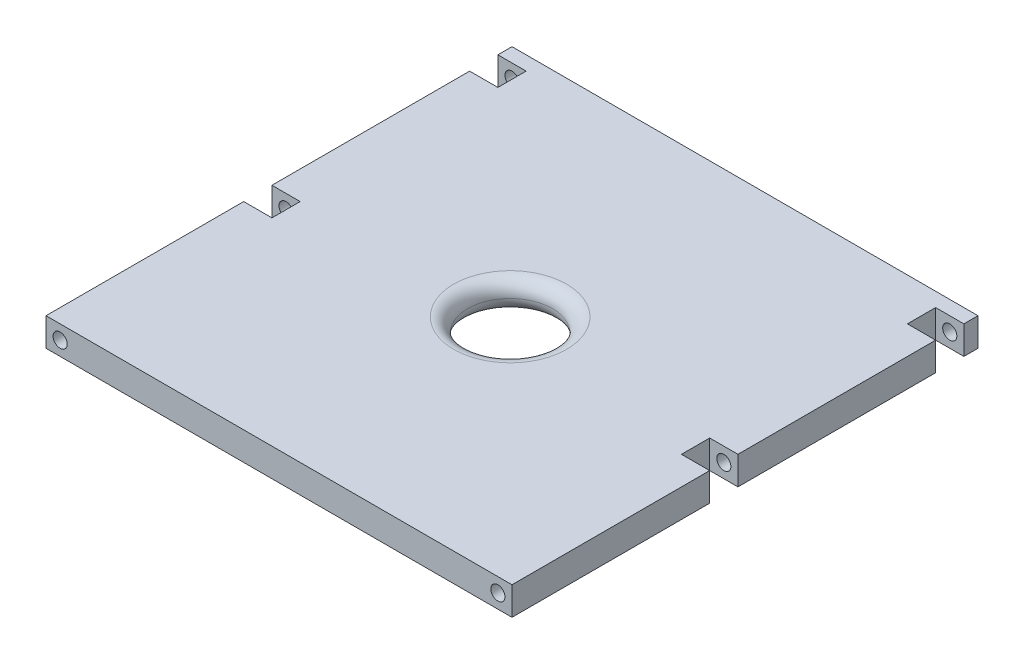
ISO-10303-21;
HEADER;
FILE_DESCRIPTION(('STEP AP214'),'2;1');
FILE_NAME('part.step','',(''),(''),'','','');
FILE_SCHEMA(('AUTOMOTIVE_DESIGN { 1 0 10303 214 1 1 1 1 }'));
ENDSEC;
DATA;
#1=APPLICATION_CONTEXT('core data for automotive mechanical design processes');
#2=APPLICATION_PROTOCOL_DEFINITION('international standard','automotive_design',2000,#1);
#3=PRODUCT_CONTEXT('',#1,'mechanical');
#4=PRODUCT('Part','Part','',(#3));
#5=PRODUCT_RELATED_PRODUCT_CATEGORY('part','',(#4));
#6=PRODUCT_DEFINITION_FORMATION('','',#4);
#7=PRODUCT_DEFINITION_CONTEXT('part definition',#1,'design');
#8=PRODUCT_DEFINITION('design','',#6,#7);
#9=PRODUCT_DEFINITION_SHAPE('','',#8);
#10=(LENGTH_UNIT() NAMED_UNIT(*) SI_UNIT(.MILLI.,.METRE.));
#11=(NAMED_UNIT(*) PLANE_ANGLE_UNIT() SI_UNIT($,.RADIAN.));
#12=(NAMED_UNIT(*) SI_UNIT($,.STERADIAN.) SOLID_ANGLE_UNIT());
#13=UNCERTAINTY_MEASURE_WITH_UNIT(LENGTH_MEASURE(1.E-05),#10,'distance_accuracy_value','');
#14=(GEOMETRIC_REPRESENTATION_CONTEXT(3) GLOBAL_UNCERTAINTY_ASSIGNED_CONTEXT((#13)) GLOBAL_UNIT_ASSIGNED_CONTEXT((#10,
#11,#12)) REPRESENTATION_CONTEXT('',''));
#15=CARTESIAN_POINT('',(0.,0.,0.));
#16=DIRECTION('',(0.,0.,1.));
#17=DIRECTION('',(1.,0.,0.));
#18=AXIS2_PLACEMENT_3D('',#15,#16,#17);
#19=CARTESIAN_POINT('',(0.,10.,0.));
#20=DIRECTION('',(0.,-1.,0.));
#21=DIRECTION('',(0.,0.,-1.));
#22=AXIS2_PLACEMENT_3D('',#19,#20,#21);
#23=PLANE('',#22);
#24=CARTESIAN_POINT('',(0.,10.,0.648107224862339));
#25=DIRECTION('',(0.,-1.,0.));
#26=DIRECTION('',(0.,0.,-1.));
#27=AXIS2_PLACEMENT_3D('',#24,#25,#26);
#28=CIRCLE('',#27,20.);
#29=CARTESIAN_POINT('',(0.,10.,-19.3518927751377));
#30=VERTEX_POINT('',#29);
#31=EDGE_CURVE('E11',#30,#30,#28,.T.);
#32=ORIENTED_EDGE('',*,*,#31,.T.);
#33=EDGE_LOOP('',(#32));
#34=FACE_BOUND('',#33,.T.);
#35=DIRECTION('',(0.,0.,1.));
#36=VECTOR('',#35,1.);
#37=CARTESIAN_POINT('',(-82.5,10.,12.5));
#38=LINE('',#37,#36);
#39=CARTESIAN_POINT('',(-82.5,10.,12.5));
#40=VERTEX_POINT('',#39);
#41=CARTESIAN_POINT('',(-82.5,10.,82.5));
#42=VERTEX_POINT('',#41);
#43=EDGE_CURVE('E241',#40,#42,#38,.T.);
#44=ORIENTED_EDGE('',*,*,#43,.T.);
#45=DIRECTION('',(1.,0.,0.));
#46=VECTOR('',#45,1.);
#47=CARTESIAN_POINT('',(82.5,10.,82.5));
#48=LINE('',#47,#46);
#49=CARTESIAN_POINT('',(82.5,10.,82.5));
#50=VERTEX_POINT('',#49);
#51=EDGE_CURVE('E130',#42,#50,#48,.T.);
#52=ORIENTED_EDGE('',*,*,#51,.T.);
#53=DIRECTION('',(0.,0.,-1.));
#54=VECTOR('',#53,1.);
#55=CARTESIAN_POINT('',(82.5,10.,12.5));
#56=LINE('',#55,#54);
#57=CARTESIAN_POINT('',(82.5,10.,12.5));
#58=VERTEX_POINT('',#57);
#59=EDGE_CURVE('E409',#50,#58,#56,.T.);
#60=ORIENTED_EDGE('',*,*,#59,.T.);
#61=DIRECTION('',(-1.,0.,0.));
#62=VECTOR('',#61,1.);
#63=CARTESIAN_POINT('',(72.5,10.,12.5));
#64=LINE('',#63,#62);
#65=CARTESIAN_POINT('',(72.5,10.,12.5));
#66=VERTEX_POINT('',#65);
#67=EDGE_CURVE('E411',#58,#66,#64,.T.);
#68=ORIENTED_EDGE('',*,*,#67,.T.);
#69=DIRECTION('',(0.,0.,-1.));
#70=VECTOR('',#69,1.);
#71=CARTESIAN_POINT('',(72.5,10.,2.49999999999997));
#72=LINE('',#71,#70);
#73=CARTESIAN_POINT('',(72.5,10.,2.49999999999997));
#74=VERTEX_POINT('',#73);
#75=EDGE_CURVE('E413',#66,#74,#72,.T.);
#76=ORIENTED_EDGE('',*,*,#75,.T.);
#77=DIRECTION('',(1.,0.,0.));
#78=VECTOR('',#77,1.);
#79=CARTESIAN_POINT('',(82.5,10.,2.49999999999999));
#80=LINE('',#79,#78);
#81=CARTESIAN_POINT('',(82.5,10.,2.49999999999999));
#82=VERTEX_POINT('',#81);
#83=EDGE_CURVE('E419',#74,#82,#80,.T.);
#84=ORIENTED_EDGE('',*,*,#83,.T.);
#85=DIRECTION('',(0.,0.,-1.));
#86=VECTOR('',#85,1.);
#87=CARTESIAN_POINT('',(82.5,10.,-67.5));
#88=LINE('',#87,#86);
#89=CARTESIAN_POINT('',(82.5,10.,-67.5));
#90=VERTEX_POINT('',#89);
#91=EDGE_CURVE('E421',#82,#90,#88,.T.);
#92=ORIENTED_EDGE('',*,*,#91,.T.);
#93=DIRECTION('',(-1.,0.,0.));
#94=VECTOR('',#93,1.);
#95=CARTESIAN_POINT('',(72.5,10.,-67.5));
#96=LINE('',#95,#94);
#97=CARTESIAN_POINT('',(72.5,10.,-67.5));
#98=VERTEX_POINT('',#97);
#99=EDGE_CURVE('E423',#90,#98,#96,.T.);
#100=ORIENTED_EDGE('',*,*,#99,.T.);
#101=DIRECTION('',(0.,0.,-1.));
#102=VECTOR('',#101,1.);
#103=CARTESIAN_POINT('',(72.5,10.,-77.5));
#104=LINE('',#103,#102);
#105=CARTESIAN_POINT('',(72.5,10.,-77.5));
#106=VERTEX_POINT('',#105);
#107=EDGE_CURVE('E425',#98,#106,#104,.T.);
#108=ORIENTED_EDGE('',*,*,#107,.T.);
#109=DIRECTION('',(1.,0.,0.));
#110=VECTOR('',#109,1.);
#111=CARTESIAN_POINT('',(82.5,10.,-77.5));
#112=LINE('',#111,#110);
#113=CARTESIAN_POINT('',(82.5,10.,-77.5));
#114=VERTEX_POINT('',#113);
#115=EDGE_CURVE('E427',#106,#114,#112,.T.);
#116=ORIENTED_EDGE('',*,*,#115,.T.);
#117=DIRECTION('',(0.,0.,-1.));
#118=VECTOR('',#117,1.);
#119=CARTESIAN_POINT('',(82.5,10.,-82.5));
#120=LINE('',#119,#118);
#121=CARTESIAN_POINT('',(82.5,10.,-82.5));
#122=VERTEX_POINT('',#121);
#123=EDGE_CURVE('E429',#114,#122,#120,.T.);
#124=ORIENTED_EDGE('',*,*,#123,.T.);
#125=DIRECTION('',(-1.,0.,0.));
#126=VECTOR('',#125,1.);
#127=CARTESIAN_POINT('',(82.5,10.,-82.5));
#128=LINE('',#127,#126);
#129=CARTESIAN_POINT('',(-82.5,10.,-82.5));
#130=VERTEX_POINT('',#129);
#131=EDGE_CURVE('E431',#122,#130,#128,.T.);
#132=ORIENTED_EDGE('',*,*,#131,.T.);
#133=DIRECTION('',(0.,0.,1.));
#134=VECTOR('',#133,1.);
#135=CARTESIAN_POINT('',(-82.5,10.,-82.5));
#136=LINE('',#135,#134);
#137=CARTESIAN_POINT('',(-82.5,10.,-77.5));
#138=VERTEX_POINT('',#137);
#139=EDGE_CURVE('E433',#130,#138,#136,.T.);
#140=ORIENTED_EDGE('',*,*,#139,.T.);
#141=DIRECTION('',(1.,0.,0.));
#142=VECTOR('',#141,1.);
#143=CARTESIAN_POINT('',(-82.5,10.,-77.5));
#144=LINE('',#143,#142);
#145=CARTESIAN_POINT('',(-72.5,10.,-77.5));
#146=VERTEX_POINT('',#145);
#147=EDGE_CURVE('E435',#138,#146,#144,.T.);
#148=ORIENTED_EDGE('',*,*,#147,.T.);
#149=DIRECTION('',(0.,0.,1.));
#150=VECTOR('',#149,1.);
#151=CARTESIAN_POINT('',(-72.5,10.,-77.5));
#152=LINE('',#151,#150);
#153=CARTESIAN_POINT('',(-72.5,10.,-67.5));
#154=VERTEX_POINT('',#153);
#155=EDGE_CURVE('E437',#146,#154,#152,.T.);
#156=ORIENTED_EDGE('',*,*,#155,.T.);
#157=DIRECTION('',(-1.,0.,0.));
#158=VECTOR('',#157,1.);
#159=CARTESIAN_POINT('',(-72.5,10.,-67.5));
#160=LINE('',#159,#158);
#161=CARTESIAN_POINT('',(-82.5,10.,-67.5));
#162=VERTEX_POINT('',#161);
#163=EDGE_CURVE('E439',#154,#162,#160,.T.);
#164=ORIENTED_EDGE('',*,*,#163,.T.);
#165=DIRECTION('',(0.,0.,1.));
#166=VECTOR('',#165,1.);
#167=CARTESIAN_POINT('',(-82.5,10.,-67.5));
#168=LINE('',#167,#166);
#169=CARTESIAN_POINT('',(-82.5,10.,2.49999999999999));
#170=VERTEX_POINT('',#169);
#171=EDGE_CURVE('E184',#162,#170,#168,.T.);
#172=ORIENTED_EDGE('',*,*,#171,.T.);
#173=DIRECTION('',(1.,0.,0.));
#174=VECTOR('',#173,1.);
#175=CARTESIAN_POINT('',(-82.5,10.,2.49999999999999));
#176=LINE('',#175,#174);
#177=CARTESIAN_POINT('',(-72.5,10.,2.49999999999997));
#178=VERTEX_POINT('',#177);
#179=EDGE_CURVE('E179',#170,#178,#176,.T.);
#180=ORIENTED_EDGE('',*,*,#179,.T.);
#181=DIRECTION('',(0.,0.,1.));
#182=VECTOR('',#181,1.);
#183=CARTESIAN_POINT('',(-72.5,10.,2.49999999999997));
#184=LINE('',#183,#182);
#185=CARTESIAN_POINT('',(-72.5,10.,12.5));
#186=VERTEX_POINT('',#185);
#187=EDGE_CURVE('E182',#178,#186,#184,.T.);
#188=ORIENTED_EDGE('',*,*,#187,.T.);
#189=DIRECTION('',(-1.,0.,0.));
#190=VECTOR('',#189,1.);
#191=CARTESIAN_POINT('',(-72.5,10.,12.5));
#192=LINE('',#191,#190);
#193=EDGE_CURVE('E50',#186,#40,#192,.T.);
#194=ORIENTED_EDGE('',*,*,#193,.T.);
#195=EDGE_LOOP('',(#44,#52,#60,#68,#76,#84,#92,#100,#108,#116,#124,#132,#140,#148,#156,#164,
#172,#180,#188,#194));
#196=FACE_BOUND('',#195,.T.);
#197=ADVANCED_FACE('F32',(#34,#196),#23,.F.);
#198=CARTESIAN_POINT('',(0.,0.,0.));
#199=DIRECTION('',(0.,-1.,0.));
#200=DIRECTION('',(0.,0.,-1.));
#201=AXIS2_PLACEMENT_3D('',#198,#199,#200);
#202=PLANE('',#201);
#203=CARTESIAN_POINT('',(0.,0.,0.648107224862339));
#204=DIRECTION('',(0.,-1.,0.));
#205=DIRECTION('',(0.,0.,-1.));
#206=AXIS2_PLACEMENT_3D('',#203,#204,#205);
#207=CIRCLE('',#206,20.);
#208=CARTESIAN_POINT('',(0.,0.,-19.3518927751377));
#209=VERTEX_POINT('',#208);
#210=EDGE_CURVE('E42',#209,#209,#207,.F.);
#211=ORIENTED_EDGE('',*,*,#210,.T.);
#212=EDGE_LOOP('',(#211));
#213=FACE_BOUND('',#212,.T.);
#214=DIRECTION('',(0.,0.,1.));
#215=VECTOR('',#214,1.);
#216=CARTESIAN_POINT('',(-82.5,0.,12.5));
#217=LINE('',#216,#215);
#218=CARTESIAN_POINT('',(-82.5,0.,12.5));
#219=VERTEX_POINT('',#218);
#220=CARTESIAN_POINT('',(-82.5,0.,82.5));
#221=VERTEX_POINT('',#220);
#222=EDGE_CURVE('E202',#219,#221,#217,.T.);
#223=ORIENTED_EDGE('',*,*,#222,.F.);
#224=DIRECTION('',(-1.,0.,0.));
#225=VECTOR('',#224,1.);
#226=CARTESIAN_POINT('',(-72.5,0.,12.5));
#227=LINE('',#226,#225);
#228=CARTESIAN_POINT('',(-72.5,0.,12.5));
#229=VERTEX_POINT('',#228);
#230=EDGE_CURVE('E121',#229,#219,#227,.T.);
#231=ORIENTED_EDGE('',*,*,#230,.F.);
#232=DIRECTION('',(0.,0.,1.));
#233=VECTOR('',#232,1.);
#234=CARTESIAN_POINT('',(-72.5,0.,2.49999999999997));
#235=LINE('',#234,#233);
#236=CARTESIAN_POINT('',(-72.5,0.,2.49999999999997));
#237=VERTEX_POINT('',#236);
#238=EDGE_CURVE('E115',#237,#229,#235,.T.);
#239=ORIENTED_EDGE('',*,*,#238,.F.);
#240=DIRECTION('',(1.,0.,0.));
#241=VECTOR('',#240,1.);
#242=CARTESIAN_POINT('',(-82.5,0.,2.49999999999999));
#243=LINE('',#242,#241);
#244=CARTESIAN_POINT('',(-82.5,0.,2.49999999999999));
#245=VERTEX_POINT('',#244);
#246=EDGE_CURVE('E192',#245,#237,#243,.T.);
#247=ORIENTED_EDGE('',*,*,#246,.F.);
#248=DIRECTION('',(0.,0.,1.));
#249=VECTOR('',#248,1.);
#250=CARTESIAN_POINT('',(-82.5,0.,-67.5));
#251=LINE('',#250,#249);
#252=CARTESIAN_POINT('',(-82.5,0.,-67.5));
#253=VERTEX_POINT('',#252);
#254=EDGE_CURVE('E236',#253,#245,#251,.T.);
#255=ORIENTED_EDGE('',*,*,#254,.F.);
#256=DIRECTION('',(-1.,0.,0.));
#257=VECTOR('',#256,1.);
#258=CARTESIAN_POINT('',(-72.5,0.,-67.5));
#259=LINE('',#258,#257);
#260=CARTESIAN_POINT('',(-72.5,0.,-67.5));
#261=VERTEX_POINT('',#260);
#262=EDGE_CURVE('E234',#261,#253,#259,.T.);
#263=ORIENTED_EDGE('',*,*,#262,.F.);
#264=DIRECTION('',(0.,0.,1.));
#265=VECTOR('',#264,1.);
#266=CARTESIAN_POINT('',(-72.5,0.,-77.5));
#267=LINE('',#266,#265);
#268=CARTESIAN_POINT('',(-72.5,0.,-77.5));
#269=VERTEX_POINT('',#268);
#270=EDGE_CURVE('E232',#269,#261,#267,.T.);
#271=ORIENTED_EDGE('',*,*,#270,.F.);
#272=DIRECTION('',(1.,0.,0.));
#273=VECTOR('',#272,1.);
#274=CARTESIAN_POINT('',(-82.5,0.,-77.5));
#275=LINE('',#274,#273);
#276=CARTESIAN_POINT('',(-82.5,0.,-77.5));
#277=VERTEX_POINT('',#276);
#278=EDGE_CURVE('E230',#277,#269,#275,.T.);
#279=ORIENTED_EDGE('',*,*,#278,.F.);
#280=DIRECTION('',(0.,0.,1.));
#281=VECTOR('',#280,1.);
#282=CARTESIAN_POINT('',(-82.5,0.,-82.5));
#283=LINE('',#282,#281);
#284=CARTESIAN_POINT('',(-82.5,0.,-82.5));
#285=VERTEX_POINT('',#284);
#286=EDGE_CURVE('E228',#285,#277,#283,.T.);
#287=ORIENTED_EDGE('',*,*,#286,.F.);
#288=DIRECTION('',(-1.,0.,0.));
#289=VECTOR('',#288,1.);
#290=CARTESIAN_POINT('',(82.5,0.,-82.5));
#291=LINE('',#290,#289);
#292=CARTESIAN_POINT('',(82.5,0.,-82.5));
#293=VERTEX_POINT('',#292);
#294=EDGE_CURVE('E226',#293,#285,#291,.T.);
#295=ORIENTED_EDGE('',*,*,#294,.F.);
#296=DIRECTION('',(0.,0.,-1.));
#297=VECTOR('',#296,1.);
#298=CARTESIAN_POINT('',(82.5,0.,-82.5));
#299=LINE('',#298,#297);
#300=CARTESIAN_POINT('',(82.5,0.,-77.5));
#301=VERTEX_POINT('',#300);
#302=EDGE_CURVE('E224',#301,#293,#299,.T.);
#303=ORIENTED_EDGE('',*,*,#302,.F.);
#304=DIRECTION('',(1.,0.,0.));
#305=VECTOR('',#304,1.);
#306=CARTESIAN_POINT('',(82.5,0.,-77.5));
#307=LINE('',#306,#305);
#308=CARTESIAN_POINT('',(72.5,0.,-77.5));
#309=VERTEX_POINT('',#308);
#310=EDGE_CURVE('E222',#309,#301,#307,.T.);
#311=ORIENTED_EDGE('',*,*,#310,.F.);
#312=DIRECTION('',(0.,0.,-1.));
#313=VECTOR('',#312,1.);
#314=CARTESIAN_POINT('',(72.5,0.,-77.5));
#315=LINE('',#314,#313);
#316=CARTESIAN_POINT('',(72.5,0.,-67.5));
#317=VERTEX_POINT('',#316);
#318=EDGE_CURVE('E220',#317,#309,#315,.T.);
#319=ORIENTED_EDGE('',*,*,#318,.F.);
#320=DIRECTION('',(-1.,0.,0.));
#321=VECTOR('',#320,1.);
#322=CARTESIAN_POINT('',(72.5,0.,-67.5));
#323=LINE('',#322,#321);
#324=CARTESIAN_POINT('',(82.5,0.,-67.5));
#325=VERTEX_POINT('',#324);
#326=EDGE_CURVE('E218',#325,#317,#323,.T.);
#327=ORIENTED_EDGE('',*,*,#326,.F.);
#328=DIRECTION('',(0.,0.,-1.));
#329=VECTOR('',#328,1.);
#330=CARTESIAN_POINT('',(82.5,0.,-67.5));
#331=LINE('',#330,#329);
#332=CARTESIAN_POINT('',(82.5,0.,2.49999999999999));
#333=VERTEX_POINT('',#332);
#334=EDGE_CURVE('E216',#333,#325,#331,.T.);
#335=ORIENTED_EDGE('',*,*,#334,.F.);
#336=DIRECTION('',(1.,0.,0.));
#337=VECTOR('',#336,1.);
#338=CARTESIAN_POINT('',(82.5,0.,2.49999999999999));
#339=LINE('',#338,#337);
#340=CARTESIAN_POINT('',(72.5,0.,2.49999999999997));
#341=VERTEX_POINT('',#340);
#342=EDGE_CURVE('E214',#341,#333,#339,.T.);
#343=ORIENTED_EDGE('',*,*,#342,.F.);
#344=DIRECTION('',(0.,0.,-1.));
#345=VECTOR('',#344,1.);
#346=CARTESIAN_POINT('',(72.5,0.,2.49999999999997));
#347=LINE('',#346,#345);
#348=CARTESIAN_POINT('',(72.5,0.,12.5));
#349=VERTEX_POINT('',#348);
#350=EDGE_CURVE('E212',#349,#341,#347,.T.);
#351=ORIENTED_EDGE('',*,*,#350,.F.);
#352=DIRECTION('',(-1.,0.,0.));
#353=VECTOR('',#352,1.);
#354=CARTESIAN_POINT('',(72.5,0.,12.5));
#355=LINE('',#354,#353);
#356=CARTESIAN_POINT('',(82.5,0.,12.5));
#357=VERTEX_POINT('',#356);
#358=EDGE_CURVE('E210',#357,#349,#355,.T.);
#359=ORIENTED_EDGE('',*,*,#358,.F.);
#360=DIRECTION('',(0.,0.,-1.));
#361=VECTOR('',#360,1.);
#362=CARTESIAN_POINT('',(82.5,0.,12.5));
#363=LINE('',#362,#361);
#364=CARTESIAN_POINT('',(82.5,0.,82.5));
#365=VERTEX_POINT('',#364);
#366=EDGE_CURVE('E208',#365,#357,#363,.T.);
#367=ORIENTED_EDGE('',*,*,#366,.F.);
#368=DIRECTION('',(1.,0.,0.));
#369=VECTOR('',#368,1.);
#370=CARTESIAN_POINT('',(82.5,0.,82.5));
#371=LINE('',#370,#369);
#372=EDGE_CURVE('E205',#221,#365,#371,.T.);
#373=ORIENTED_EDGE('',*,*,#372,.F.);
#374=EDGE_LOOP('',(#223,#231,#239,#247,#255,#263,#271,#279,#287,#295,#303,#311,#319,#327,#335,
#343,#351,#359,#367,#373));
#375=FACE_BOUND('',#374,.T.);
#376=ADVANCED_FACE('F300',(#213,#375),#202,.T.);
#377=CARTESIAN_POINT('',(-82.5,10.,12.5));
#378=DIRECTION('',(1.,0.,0.));
#379=DIRECTION('',(0.,0.,-1.));
#380=AXIS2_PLACEMENT_3D('',#377,#378,#379);
#381=PLANE('',#380);
#382=ORIENTED_EDGE('',*,*,#222,.T.);
#383=DIRECTION('',(0.,-1.,0.));
#384=VECTOR('',#383,1.);
#385=CARTESIAN_POINT('',(-82.5,10.,82.5));
#386=LINE('',#385,#384);
#387=EDGE_CURVE('E290',#42,#221,#386,.T.);
#388=ORIENTED_EDGE('',*,*,#387,.F.);
#389=ORIENTED_EDGE('',*,*,#43,.F.);
#390=DIRECTION('',(0.,-1.,0.));
#391=VECTOR('',#390,1.);
#392=CARTESIAN_POINT('',(-82.5,10.,12.5));
#393=LINE('',#392,#391);
#394=EDGE_CURVE('E198',#40,#219,#393,.T.);
#395=ORIENTED_EDGE('',*,*,#394,.T.);
#396=EDGE_LOOP('',(#382,#388,#389,#395));
#397=FACE_BOUND('',#396,.T.);
#398=ADVANCED_FACE('F319',(#397),#381,.F.);
#399=CARTESIAN_POINT('',(82.5,10.,82.5));
#400=DIRECTION('',(0.,0.,-1.));
#401=DIRECTION('',(-1.,0.,0.));
#402=AXIS2_PLACEMENT_3D('',#399,#400,#401);
#403=PLANE('',#402);
#404=CARTESIAN_POINT('',(-77.5,5.,82.5));
#405=DIRECTION('',(0.,0.,-1.));
#406=DIRECTION('',(1.,0.,0.));
#407=AXIS2_PLACEMENT_3D('',#404,#405,#406);
#408=CIRCLE('',#407,2.5);
#409=CARTESIAN_POINT('',(-75.,5.,82.5));
#410=VERTEX_POINT('',#409);
#411=EDGE_CURVE('E296',#410,#410,#408,.T.);
#412=ORIENTED_EDGE('',*,*,#411,.T.);
#413=EDGE_LOOP('',(#412));
#414=FACE_BOUND('',#413,.T.);
#415=CARTESIAN_POINT('',(77.5,5.,82.5));
#416=DIRECTION('',(0.,0.,-1.));
#417=DIRECTION('',(-1.,0.,0.));
#418=AXIS2_PLACEMENT_3D('',#415,#416,#417);
#419=CIRCLE('',#418,2.5);
#420=CARTESIAN_POINT('',(75.,5.,82.5));
#421=VERTEX_POINT('',#420);
#422=EDGE_CURVE('E497',#421,#421,#419,.T.);
#423=ORIENTED_EDGE('',*,*,#422,.T.);
#424=EDGE_LOOP('',(#423));
#425=FACE_BOUND('',#424,.T.);
#426=ORIENTED_EDGE('',*,*,#372,.T.);
#427=DIRECTION('',(0.,-1.,0.));
#428=VECTOR('',#427,1.);
#429=CARTESIAN_POINT('',(82.5,10.,82.5));
#430=LINE('',#429,#428);
#431=EDGE_CURVE('E287',#50,#365,#430,.T.);
#432=ORIENTED_EDGE('',*,*,#431,.F.);
#433=ORIENTED_EDGE('',*,*,#51,.F.);
#434=ORIENTED_EDGE('',*,*,#387,.T.);
#435=EDGE_LOOP('',(#426,#432,#433,#434));
#436=FACE_BOUND('',#435,.T.);
#437=ADVANCED_FACE('F394',(#414,#425,#436),#403,.F.);
#438=CARTESIAN_POINT('',(82.5,10.,12.5));
#439=DIRECTION('',(-1.,0.,0.));
#440=DIRECTION('',(0.,0.,1.));
#441=AXIS2_PLACEMENT_3D('',#438,#439,#440);
#442=PLANE('',#441);
#443=ORIENTED_EDGE('',*,*,#366,.T.);
#444=DIRECTION('',(0.,-1.,0.));
#445=VECTOR('',#444,1.);
#446=CARTESIAN_POINT('',(82.5,10.,12.5));
#447=LINE('',#446,#445);
#448=EDGE_CURVE('E284',#58,#357,#447,.T.);
#449=ORIENTED_EDGE('',*,*,#448,.F.);
#450=ORIENTED_EDGE('',*,*,#59,.F.);
#451=ORIENTED_EDGE('',*,*,#431,.T.);
#452=EDGE_LOOP('',(#443,#449,#450,#451));
#453=FACE_BOUND('',#452,.T.);
#454=ADVANCED_FACE('F390',(#453),#442,.F.);
#455=CARTESIAN_POINT('',(72.5,10.,12.5));
#456=DIRECTION('',(0.,0.,1.));
#457=DIRECTION('',(1.,0.,0.));
#458=AXIS2_PLACEMENT_3D('',#455,#456,#457);
#459=PLANE('',#458);
#460=CARTESIAN_POINT('',(77.5,5.,12.5));
#461=DIRECTION('',(0.,0.,1.));
#462=DIRECTION('',(1.,0.,0.));
#463=AXIS2_PLACEMENT_3D('',#460,#461,#462);
#464=CIRCLE('',#463,2.5);
#465=CARTESIAN_POINT('',(80.,5.,12.5));
#466=VERTEX_POINT('',#465);
#467=EDGE_CURVE('E206',#466,#466,#464,.T.);
#468=ORIENTED_EDGE('',*,*,#467,.T.);
#469=EDGE_LOOP('',(#468));
#470=FACE_BOUND('',#469,.T.);
#471=ORIENTED_EDGE('',*,*,#358,.T.);
#472=DIRECTION('',(0.,-1.,0.));
#473=VECTOR('',#472,1.);
#474=CARTESIAN_POINT('',(72.5,10.,12.5));
#475=LINE('',#474,#473);
#476=EDGE_CURVE('E281',#66,#349,#475,.T.);
#477=ORIENTED_EDGE('',*,*,#476,.F.);
#478=ORIENTED_EDGE('',*,*,#67,.F.);
#479=ORIENTED_EDGE('',*,*,#448,.T.);
#480=EDGE_LOOP('',(#471,#477,#478,#479));
#481=FACE_BOUND('',#480,.T.);
#482=ADVANCED_FACE('F386',(#470,#481),#459,.F.);
#483=CARTESIAN_POINT('',(72.5,10.,2.49999999999997));
#484=DIRECTION('',(-1.,0.,0.));
#485=DIRECTION('',(0.,0.,1.));
#486=AXIS2_PLACEMENT_3D('',#483,#484,#485);
#487=PLANE('',#486);
#488=ORIENTED_EDGE('',*,*,#350,.T.);
#489=DIRECTION('',(0.,-1.,0.));
#490=VECTOR('',#489,1.);
#491=CARTESIAN_POINT('',(72.5,10.,2.49999999999997));
#492=LINE('',#491,#490);
#493=EDGE_CURVE('E278',#74,#341,#492,.T.);
#494=ORIENTED_EDGE('',*,*,#493,.F.);
#495=ORIENTED_EDGE('',*,*,#75,.F.);
#496=ORIENTED_EDGE('',*,*,#476,.T.);
#497=EDGE_LOOP('',(#488,#494,#495,#496));
#498=FACE_BOUND('',#497,.T.);
#499=ADVANCED_FACE('F382',(#498),#487,.F.);
#500=CARTESIAN_POINT('',(82.5,10.,2.49999999999999));
#501=DIRECTION('',(0.,0.,-1.));
#502=DIRECTION('',(-1.,0.,0.));
#503=AXIS2_PLACEMENT_3D('',#500,#501,#502);
#504=PLANE('',#503);
#505=CARTESIAN_POINT('',(77.5,5.,2.49999999999999));
#506=DIRECTION('',(0.,0.,-1.));
#507=DIRECTION('',(-1.,0.,0.));
#508=AXIS2_PLACEMENT_3D('',#505,#506,#507);
#509=CIRCLE('',#508,2.5);
#510=CARTESIAN_POINT('',(75.,5.,2.49999999999998));
#511=VERTEX_POINT('',#510);
#512=EDGE_CURVE('E488',#511,#511,#509,.T.);
#513=ORIENTED_EDGE('',*,*,#512,.T.);
#514=EDGE_LOOP('',(#513));
#515=FACE_BOUND('',#514,.T.);
#516=ORIENTED_EDGE('',*,*,#342,.T.);
#517=DIRECTION('',(0.,-1.,0.));
#518=VECTOR('',#517,1.);
#519=CARTESIAN_POINT('',(82.5,10.,2.49999999999999));
#520=LINE('',#519,#518);
#521=EDGE_CURVE('E275',#82,#333,#520,.T.);
#522=ORIENTED_EDGE('',*,*,#521,.F.);
#523=ORIENTED_EDGE('',*,*,#83,.F.);
#524=ORIENTED_EDGE('',*,*,#493,.T.);
#525=EDGE_LOOP('',(#516,#522,#523,#524));
#526=FACE_BOUND('',#525,.T.);
#527=ADVANCED_FACE('F378',(#515,#526),#504,.F.);
#528=CARTESIAN_POINT('',(82.5,10.,-67.5));
#529=DIRECTION('',(-1.,0.,0.));
#530=DIRECTION('',(0.,0.,1.));
#531=AXIS2_PLACEMENT_3D('',#528,#529,#530);
#532=PLANE('',#531);
#533=ORIENTED_EDGE('',*,*,#334,.T.);
#534=DIRECTION('',(0.,-1.,0.));
#535=VECTOR('',#534,1.);
#536=CARTESIAN_POINT('',(82.5,10.,-67.5));
#537=LINE('',#536,#535);
#538=EDGE_CURVE('E272',#90,#325,#537,.T.);
#539=ORIENTED_EDGE('',*,*,#538,.F.);
#540=ORIENTED_EDGE('',*,*,#91,.F.);
#541=ORIENTED_EDGE('',*,*,#521,.T.);
#542=EDGE_LOOP('',(#533,#539,#540,#541));
#543=FACE_BOUND('',#542,.T.);
#544=ADVANCED_FACE('F374',(#543),#532,.F.);
#545=CARTESIAN_POINT('',(72.5,10.,-67.5));
#546=DIRECTION('',(0.,0.,1.));
#547=DIRECTION('',(1.,0.,0.));
#548=AXIS2_PLACEMENT_3D('',#545,#546,#547);
#549=PLANE('',#548);
#550=CARTESIAN_POINT('',(77.5,5.,-67.5));
#551=DIRECTION('',(0.,0.,1.));
#552=DIRECTION('',(1.,0.,0.));
#553=AXIS2_PLACEMENT_3D('',#550,#551,#552);
#554=CIRCLE('',#553,2.5);
#555=CARTESIAN_POINT('',(80.,5.,-67.5));
#556=VERTEX_POINT('',#555);
#557=EDGE_CURVE('E491',#556,#556,#554,.T.);
#558=ORIENTED_EDGE('',*,*,#557,.T.);
#559=EDGE_LOOP('',(#558));
#560=FACE_BOUND('',#559,.T.);
#561=ORIENTED_EDGE('',*,*,#326,.T.);
#562=DIRECTION('',(0.,-1.,0.));
#563=VECTOR('',#562,1.);
#564=CARTESIAN_POINT('',(72.5,10.,-67.5));
#565=LINE('',#564,#563);
#566=EDGE_CURVE('E269',#98,#317,#565,.T.);
#567=ORIENTED_EDGE('',*,*,#566,.F.);
#568=ORIENTED_EDGE('',*,*,#99,.F.);
#569=ORIENTED_EDGE('',*,*,#538,.T.);
#570=EDGE_LOOP('',(#561,#567,#568,#569));
#571=FACE_BOUND('',#570,.T.);
#572=ADVANCED_FACE('F370',(#560,#571),#549,.F.);
#573=CARTESIAN_POINT('',(72.5,10.,-77.5));
#574=DIRECTION('',(-1.,0.,0.));
#575=DIRECTION('',(0.,0.,1.));
#576=AXIS2_PLACEMENT_3D('',#573,#574,#575);
#577=PLANE('',#576);
#578=ORIENTED_EDGE('',*,*,#318,.T.);
#579=DIRECTION('',(0.,-1.,0.));
#580=VECTOR('',#579,1.);
#581=CARTESIAN_POINT('',(72.5,10.,-77.5));
#582=LINE('',#581,#580);
#583=EDGE_CURVE('E266',#106,#309,#582,.T.);
#584=ORIENTED_EDGE('',*,*,#583,.F.);
#585=ORIENTED_EDGE('',*,*,#107,.F.);
#586=ORIENTED_EDGE('',*,*,#566,.T.);
#587=EDGE_LOOP('',(#578,#584,#585,#586));
#588=FACE_BOUND('',#587,.T.);
#589=ADVANCED_FACE('F366',(#588),#577,.F.);
#590=CARTESIAN_POINT('',(82.5,10.,-77.5));
#591=DIRECTION('',(0.,0.,-1.));
#592=DIRECTION('',(-1.,0.,0.));
#593=AXIS2_PLACEMENT_3D('',#590,#591,#592);
#594=PLANE('',#593);
#595=CARTESIAN_POINT('',(77.5,5.,-77.5));
#596=DIRECTION('',(0.,0.,-1.));
#597=DIRECTION('',(-1.,0.,0.));
#598=AXIS2_PLACEMENT_3D('',#595,#596,#597);
#599=CIRCLE('',#598,2.5);
#600=CARTESIAN_POINT('',(75.,5.,-77.5));
#601=VERTEX_POINT('',#600);
#602=EDGE_CURVE('E494',#601,#601,#599,.T.);
#603=ORIENTED_EDGE('',*,*,#602,.T.);
#604=EDGE_LOOP('',(#603));
#605=FACE_BOUND('',#604,.T.);
#606=ORIENTED_EDGE('',*,*,#310,.T.);
#607=DIRECTION('',(0.,-1.,0.));
#608=VECTOR('',#607,1.);
#609=CARTESIAN_POINT('',(82.5,10.,-77.5));
#610=LINE('',#609,#608);
#611=EDGE_CURVE('E263',#114,#301,#610,.T.);
#612=ORIENTED_EDGE('',*,*,#611,.F.);
#613=ORIENTED_EDGE('',*,*,#115,.F.);
#614=ORIENTED_EDGE('',*,*,#583,.T.);
#615=EDGE_LOOP('',(#606,#612,#613,#614));
#616=FACE_BOUND('',#615,.T.);
#617=ADVANCED_FACE('F362',(#605,#616),#594,.F.);
#618=CARTESIAN_POINT('',(82.5,10.,-82.5));
#619=DIRECTION('',(-1.,0.,0.));
#620=DIRECTION('',(0.,0.,1.));
#621=AXIS2_PLACEMENT_3D('',#618,#619,#620);
#622=PLANE('',#621);
#623=ORIENTED_EDGE('',*,*,#302,.T.);
#624=DIRECTION('',(0.,-1.,0.));
#625=VECTOR('',#624,1.);
#626=CARTESIAN_POINT('',(82.5,10.,-82.5));
#627=LINE('',#626,#625);
#628=EDGE_CURVE('E260',#122,#293,#627,.T.);
#629=ORIENTED_EDGE('',*,*,#628,.F.);
#630=ORIENTED_EDGE('',*,*,#123,.F.);
#631=ORIENTED_EDGE('',*,*,#611,.T.);
#632=EDGE_LOOP('',(#623,#629,#630,#631));
#633=FACE_BOUND('',#632,.T.);
#634=ADVANCED_FACE('F358',(#633),#622,.F.);
#635=CARTESIAN_POINT('',(82.5,10.,-82.5));
#636=DIRECTION('',(0.,0.,1.));
#637=DIRECTION('',(1.,0.,0.));
#638=AXIS2_PLACEMENT_3D('',#635,#636,#637);
#639=PLANE('',#638);
#640=CARTESIAN_POINT('',(-77.5,5.,-82.5));
#641=DIRECTION('',(0.,0.,-1.));
#642=DIRECTION('',(1.,0.,0.));
#643=AXIS2_PLACEMENT_3D('',#640,#641,#642);
#644=CIRCLE('',#643,2.5);
#645=CARTESIAN_POINT('',(-75.,5.,-82.5));
#646=VERTEX_POINT('',#645);
#647=EDGE_CURVE('E511',#646,#646,#644,.T.);
#648=ORIENTED_EDGE('',*,*,#647,.F.);
#649=EDGE_LOOP('',(#648));
#650=FACE_BOUND('',#649,.T.);
#651=CARTESIAN_POINT('',(77.5,5.,-82.5));
#652=DIRECTION('',(0.,0.,-1.));
#653=DIRECTION('',(-1.,0.,0.));
#654=AXIS2_PLACEMENT_3D('',#651,#652,#653);
#655=CIRCLE('',#654,2.5);
#656=CARTESIAN_POINT('',(75.,5.,-82.5));
#657=VERTEX_POINT('',#656);
#658=EDGE_CURVE('E498',#657,#657,#655,.T.);
#659=ORIENTED_EDGE('',*,*,#658,.F.);
#660=EDGE_LOOP('',(#659));
#661=FACE_BOUND('',#660,.T.);
#662=ORIENTED_EDGE('',*,*,#294,.T.);
#663=DIRECTION('',(0.,-1.,0.));
#664=VECTOR('',#663,1.);
#665=CARTESIAN_POINT('',(-82.5,10.,-82.5));
#666=LINE('',#665,#664);
#667=EDGE_CURVE('E257',#130,#285,#666,.T.);
#668=ORIENTED_EDGE('',*,*,#667,.F.);
#669=ORIENTED_EDGE('',*,*,#131,.F.);
#670=ORIENTED_EDGE('',*,*,#628,.T.);
#671=EDGE_LOOP('',(#662,#668,#669,#670));
#672=FACE_BOUND('',#671,.T.);
#673=ADVANCED_FACE('F354',(#650,#661,#672),#639,.F.);
#674=CARTESIAN_POINT('',(-82.5,10.,-82.5));
#675=DIRECTION('',(1.,0.,0.));
#676=DIRECTION('',(0.,0.,-1.));
#677=AXIS2_PLACEMENT_3D('',#674,#675,#676);
#678=PLANE('',#677);
#679=ORIENTED_EDGE('',*,*,#286,.T.);
#680=DIRECTION('',(0.,-1.,0.));
#681=VECTOR('',#680,1.);
#682=CARTESIAN_POINT('',(-82.5,10.,-77.5));
#683=LINE('',#682,#681);
#684=EDGE_CURVE('E254',#138,#277,#683,.T.);
#685=ORIENTED_EDGE('',*,*,#684,.F.);
#686=ORIENTED_EDGE('',*,*,#139,.F.);
#687=ORIENTED_EDGE('',*,*,#667,.T.);
#688=EDGE_LOOP('',(#679,#685,#686,#687));
#689=FACE_BOUND('',#688,.T.);
#690=ADVANCED_FACE('F350',(#689),#678,.F.);
#691=CARTESIAN_POINT('',(-82.5,10.,-77.5));
#692=DIRECTION('',(0.,0.,-1.));
#693=DIRECTION('',(-1.,0.,0.));
#694=AXIS2_PLACEMENT_3D('',#691,#692,#693);
#695=PLANE('',#694);
#696=CARTESIAN_POINT('',(-77.5,5.,-77.5));
#697=DIRECTION('',(0.,0.,-1.));
#698=DIRECTION('',(-1.,0.,0.));
#699=AXIS2_PLACEMENT_3D('',#696,#697,#698);
#700=CIRCLE('',#699,2.5);
#701=CARTESIAN_POINT('',(-80.,5.,-77.5));
#702=VERTEX_POINT('',#701);
#703=EDGE_CURVE('E501',#702,#702,#700,.T.);
#704=ORIENTED_EDGE('',*,*,#703,.T.);
#705=EDGE_LOOP('',(#704));
#706=FACE_BOUND('',#705,.T.);
#707=ORIENTED_EDGE('',*,*,#278,.T.);
#708=DIRECTION('',(0.,-1.,0.));
#709=VECTOR('',#708,1.);
#710=CARTESIAN_POINT('',(-72.5,10.,-77.5));
#711=LINE('',#710,#709);
#712=EDGE_CURVE('E251',#146,#269,#711,.T.);
#713=ORIENTED_EDGE('',*,*,#712,.F.);
#714=ORIENTED_EDGE('',*,*,#147,.F.);
#715=ORIENTED_EDGE('',*,*,#684,.T.);
#716=EDGE_LOOP('',(#707,#713,#714,#715));
#717=FACE_BOUND('',#716,.T.);
#718=ADVANCED_FACE('F346',(#706,#717),#695,.F.);
#719=CARTESIAN_POINT('',(-72.5,10.,-77.5));
#720=DIRECTION('',(1.,0.,0.));
#721=DIRECTION('',(0.,0.,-1.));
#722=AXIS2_PLACEMENT_3D('',#719,#720,#721);
#723=PLANE('',#722);
#724=ORIENTED_EDGE('',*,*,#270,.T.);
#725=DIRECTION('',(0.,-1.,0.));
#726=VECTOR('',#725,1.);
#727=CARTESIAN_POINT('',(-72.5,10.,-67.5));
#728=LINE('',#727,#726);
#729=EDGE_CURVE('E248',#154,#261,#728,.T.);
#730=ORIENTED_EDGE('',*,*,#729,.F.);
#731=ORIENTED_EDGE('',*,*,#155,.F.);
#732=ORIENTED_EDGE('',*,*,#712,.T.);
#733=EDGE_LOOP('',(#724,#730,#731,#732));
#734=FACE_BOUND('',#733,.T.);
#735=ADVANCED_FACE('F342',(#734),#723,.F.);
#736=CARTESIAN_POINT('',(-72.5,10.,-67.5));
#737=DIRECTION('',(0.,0.,1.));
#738=DIRECTION('',(1.,0.,0.));
#739=AXIS2_PLACEMENT_3D('',#736,#737,#738);
#740=PLANE('',#739);
#741=CARTESIAN_POINT('',(-77.5,5.,-67.5));
#742=DIRECTION('',(0.,0.,1.));
#743=DIRECTION('',(1.,0.,0.));
#744=AXIS2_PLACEMENT_3D('',#741,#742,#743);
#745=CIRCLE('',#744,2.5);
#746=CARTESIAN_POINT('',(-75.,5.,-67.5));
#747=VERTEX_POINT('',#746);
#748=EDGE_CURVE('E506',#747,#747,#745,.T.);
#749=ORIENTED_EDGE('',*,*,#748,.T.);
#750=EDGE_LOOP('',(#749));
#751=FACE_BOUND('',#750,.T.);
#752=ORIENTED_EDGE('',*,*,#262,.T.);
#753=DIRECTION('',(0.,-1.,0.));
#754=VECTOR('',#753,1.);
#755=CARTESIAN_POINT('',(-82.5,10.,-67.5));
#756=LINE('',#755,#754);
#757=EDGE_CURVE('E245',#162,#253,#756,.T.);
#758=ORIENTED_EDGE('',*,*,#757,.F.);
#759=ORIENTED_EDGE('',*,*,#163,.F.);
#760=ORIENTED_EDGE('',*,*,#729,.T.);
#761=EDGE_LOOP('',(#752,#758,#759,#760));
#762=FACE_BOUND('',#761,.T.);
#763=ADVANCED_FACE('F338',(#751,#762),#740,.F.);
#764=CARTESIAN_POINT('',(-82.5,10.,-67.5));
#765=DIRECTION('',(1.,0.,0.));
#766=DIRECTION('',(0.,0.,-1.));
#767=AXIS2_PLACEMENT_3D('',#764,#765,#766);
#768=PLANE('',#767);
#769=ORIENTED_EDGE('',*,*,#254,.T.);
#770=DIRECTION('',(0.,-1.,0.));
#771=VECTOR('',#770,1.);
#772=CARTESIAN_POINT('',(-82.5,10.,2.49999999999999));
#773=LINE('',#772,#771);
#774=EDGE_CURVE('E193',#170,#245,#773,.T.);
#775=ORIENTED_EDGE('',*,*,#774,.F.);
#776=ORIENTED_EDGE('',*,*,#171,.F.);
#777=ORIENTED_EDGE('',*,*,#757,.T.);
#778=EDGE_LOOP('',(#769,#775,#776,#777));
#779=FACE_BOUND('',#778,.T.);
#780=ADVANCED_FACE('F334',(#779),#768,.F.);
#781=CARTESIAN_POINT('',(-82.5,10.,2.49999999999999));
#782=DIRECTION('',(0.,0.,-1.));
#783=DIRECTION('',(-1.,0.,0.));
#784=AXIS2_PLACEMENT_3D('',#781,#782,#783);
#785=PLANE('',#784);
#786=CARTESIAN_POINT('',(-77.5,5.,2.49999999999997));
#787=DIRECTION('',(0.,0.,-1.));
#788=DIRECTION('',(-1.,0.,0.));
#789=AXIS2_PLACEMENT_3D('',#786,#787,#788);
#790=CIRCLE('',#789,2.5);
#791=CARTESIAN_POINT('',(-80.,5.,2.49999999999998));
#792=VERTEX_POINT('',#791);
#793=EDGE_CURVE('E295',#792,#792,#790,.T.);
#794=ORIENTED_EDGE('',*,*,#793,.T.);
#795=EDGE_LOOP('',(#794));
#796=FACE_BOUND('',#795,.T.);
#797=ORIENTED_EDGE('',*,*,#246,.T.);
#798=DIRECTION('',(0.,-1.,0.));
#799=VECTOR('',#798,1.);
#800=CARTESIAN_POINT('',(-72.5,10.,2.49999999999997));
#801=LINE('',#800,#799);
#802=EDGE_CURVE('E189',#178,#237,#801,.T.);
#803=ORIENTED_EDGE('',*,*,#802,.F.);
#804=ORIENTED_EDGE('',*,*,#179,.F.);
#805=ORIENTED_EDGE('',*,*,#774,.T.);
#806=EDGE_LOOP('',(#797,#803,#804,#805));
#807=FACE_BOUND('',#806,.T.);
#808=ADVANCED_FACE('F190',(#796,#807),#785,.F.);
#809=CARTESIAN_POINT('',(-72.5,10.,2.49999999999997));
#810=DIRECTION('',(1.,0.,0.));
#811=DIRECTION('',(0.,0.,-1.));
#812=AXIS2_PLACEMENT_3D('',#809,#810,#811);
#813=PLANE('',#812);
#814=ORIENTED_EDGE('',*,*,#238,.T.);
#815=DIRECTION('',(0.,-1.,0.));
#816=VECTOR('',#815,1.);
#817=CARTESIAN_POINT('',(-72.5,10.,12.5));
#818=LINE('',#817,#816);
#819=EDGE_CURVE('E194',#186,#229,#818,.T.);
#820=ORIENTED_EDGE('',*,*,#819,.F.);
#821=ORIENTED_EDGE('',*,*,#187,.F.);
#822=ORIENTED_EDGE('',*,*,#802,.T.);
#823=EDGE_LOOP('',(#814,#820,#821,#822));
#824=FACE_BOUND('',#823,.T.);
#825=ADVANCED_FACE('F196',(#824),#813,.F.);
#826=CARTESIAN_POINT('',(-72.5,10.,12.5));
#827=DIRECTION('',(0.,0.,1.));
#828=DIRECTION('',(1.,0.,0.));
#829=AXIS2_PLACEMENT_3D('',#826,#827,#828);
#830=PLANE('',#829);
#831=CARTESIAN_POINT('',(-77.5,5.,12.5));
#832=DIRECTION('',(0.,0.,1.));
#833=DIRECTION('',(1.,0.,0.));
#834=AXIS2_PLACEMENT_3D('',#831,#832,#833);
#835=CIRCLE('',#834,2.5);
#836=CARTESIAN_POINT('',(-75.,5.,12.5));
#837=VERTEX_POINT('',#836);
#838=EDGE_CURVE('E292',#837,#837,#835,.T.);
#839=ORIENTED_EDGE('',*,*,#838,.T.);
#840=EDGE_LOOP('',(#839));
#841=FACE_BOUND('',#840,.T.);
#842=ORIENTED_EDGE('',*,*,#230,.T.);
#843=ORIENTED_EDGE('',*,*,#394,.F.);
#844=ORIENTED_EDGE('',*,*,#193,.F.);
#845=ORIENTED_EDGE('',*,*,#819,.T.);
#846=EDGE_LOOP('',(#842,#843,#844,#845));
#847=FACE_BOUND('',#846,.T.);
#848=ADVANCED_FACE('F325',(#841,#847),#830,.F.);
#849=CARTESIAN_POINT('',(77.5,5.,82.5));
#850=DIRECTION('',(0.,0.,-1.));
#851=DIRECTION('',(-1.,0.,0.));
#852=AXIS2_PLACEMENT_3D('',#849,#850,#851);
#853=CYLINDRICAL_SURFACE('',#852,2.5);
#854=ORIENTED_EDGE('',*,*,#658,.T.);
#855=EDGE_LOOP('',(#854));
#856=FACE_BOUND('',#855,.T.);
#857=ORIENTED_EDGE('',*,*,#602,.F.);
#858=EDGE_LOOP('',(#857));
#859=FACE_BOUND('',#858,.T.);
#860=ADVANCED_FACE('F328',(#856,#859),#853,.F.);
#861=ORIENTED_EDGE('',*,*,#557,.F.);
#862=EDGE_LOOP('',(#861));
#863=FACE_BOUND('',#862,.T.);
#864=ORIENTED_EDGE('',*,*,#512,.F.);
#865=EDGE_LOOP('',(#864));
#866=FACE_BOUND('',#865,.T.);
#867=ADVANCED_FACE('F528',(#863,#866),#853,.F.);
#868=ORIENTED_EDGE('',*,*,#422,.F.);
#869=EDGE_LOOP('',(#868));
#870=FACE_BOUND('',#869,.T.);
#871=ORIENTED_EDGE('',*,*,#467,.F.);
#872=EDGE_LOOP('',(#871));
#873=FACE_BOUND('',#872,.T.);
#874=ADVANCED_FACE('F322',(#870,#873),#853,.F.);
#875=CARTESIAN_POINT('',(-77.5,5.,82.5));
#876=DIRECTION('',(0.,0.,-1.));
#877=DIRECTION('',(-1.,0.,0.));
#878=AXIS2_PLACEMENT_3D('',#875,#876,#877);
#879=CYLINDRICAL_SURFACE('',#878,2.5);
#880=ORIENTED_EDGE('',*,*,#411,.F.);
#881=EDGE_LOOP('',(#880));
#882=FACE_BOUND('',#881,.T.);
#883=ORIENTED_EDGE('',*,*,#838,.F.);
#884=EDGE_LOOP('',(#883));
#885=FACE_BOUND('',#884,.T.);
#886=ADVANCED_FACE('F518',(#882,#885),#879,.F.);
#887=ORIENTED_EDGE('',*,*,#793,.F.);
#888=EDGE_LOOP('',(#887));
#889=FACE_BOUND('',#888,.T.);
#890=ORIENTED_EDGE('',*,*,#748,.F.);
#891=EDGE_LOOP('',(#890));
#892=FACE_BOUND('',#891,.T.);
#893=ADVANCED_FACE('F521',(#889,#892),#879,.F.);
#894=ORIENTED_EDGE('',*,*,#647,.T.);
#895=EDGE_LOOP('',(#894));
#896=FACE_BOUND('',#895,.T.);
#897=ORIENTED_EDGE('',*,*,#703,.F.);
#898=EDGE_LOOP('',(#897));
#899=FACE_BOUND('',#898,.T.);
#900=ADVANCED_FACE('F309',(#896,#899),#879,.F.);
#901=CARTESIAN_POINT('',(0.,5.,0.648107224862339));
#902=DIRECTION('',(0.,-1.,0.));
#903=DIRECTION('',(0.,0.,-1.));
#904=AXIS2_PLACEMENT_3D('',#901,#902,#903);
#905=TOROIDAL_SURFACE('',#904,20.,5.);
#906=ORIENTED_EDGE('',*,*,#31,.F.);
#907=EDGE_LOOP('',(#906));
#908=FACE_BOUND('',#907,.T.);
#909=CARTESIAN_POINT('',(0.,5.,0.648107224862339));
#910=DIRECTION('',(0.,-1.,0.));
#911=DIRECTION('',(0.,0.,-1.));
#912=AXIS2_PLACEMENT_3D('',#909,#910,#911);
#913=CIRCLE('',#912,15.);
#914=CARTESIAN_POINT('',(0.,5.,-14.3518927751377));
#915=VERTEX_POINT('',#914);
#916=EDGE_CURVE('E36',#915,#915,#913,.F.);
#917=ORIENTED_EDGE('',*,*,#916,.F.);
#918=EDGE_LOOP('',(#917));
#919=FACE_BOUND('',#918,.T.);
#920=ADVANCED_FACE('F34',(#908,#919),#905,.T.);
#921=CARTESIAN_POINT('',(0.,5.,0.648107224862339));
#922=DIRECTION('',(0.,-1.,0.));
#923=DIRECTION('',(0.,0.,-1.));
#924=AXIS2_PLACEMENT_3D('',#921,#922,#923);
#925=TOROIDAL_SURFACE('',#924,20.,5.);
#926=ORIENTED_EDGE('',*,*,#916,.T.);
#927=EDGE_LOOP('',(#926));
#928=FACE_BOUND('',#927,.T.);
#929=ORIENTED_EDGE('',*,*,#210,.F.);
#930=EDGE_LOOP('',(#929));
#931=FACE_BOUND('',#930,.T.);
#932=ADVANCED_FACE('F303',(#928,#931),#925,.T.);
#933=CLOSED_SHELL('',(#197,#376,#398,#437,#454,#482,#499,#527,#544,#572,#589,#617,#634,#673,
#690,#718,#735,#763,#780,#808,#825,#848,#860,#867,#874,#886,#893,#900,#920,#932));
#934=MANIFOLD_SOLID_BREP('B2',#933);
#935=ADVANCED_BREP_SHAPE_REPRESENTATION('',(#18,#934),#14);
#936=SHAPE_DEFINITION_REPRESENTATION(#9,#935);
ENDSEC;
END-ISO-10303-21;
